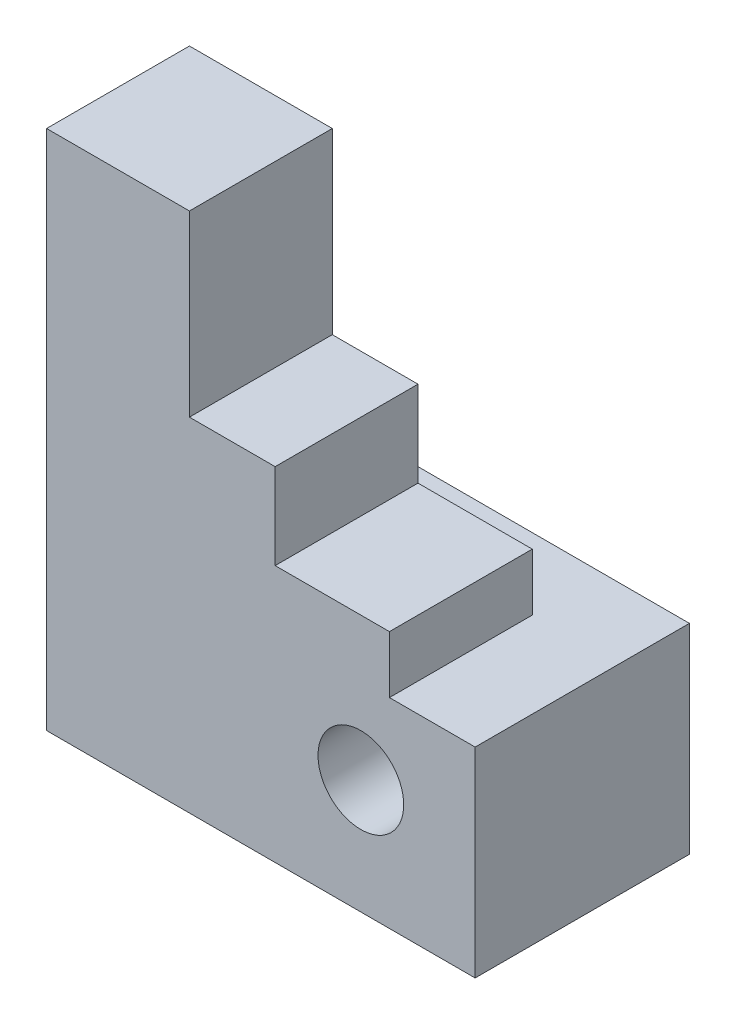
ISO-10303-21;
HEADER;
FILE_DESCRIPTION(('STEP AP214'),'2;1');
FILE_NAME('part.step','',(''),(''),'','','');
FILE_SCHEMA(('AUTOMOTIVE_DESIGN { 1 0 10303 214 1 1 1 1 }'));
ENDSEC;
DATA;
#1=APPLICATION_CONTEXT('core data for automotive mechanical design processes');
#2=APPLICATION_PROTOCOL_DEFINITION('international standard','automotive_design',2000,#1);
#3=PRODUCT_CONTEXT('',#1,'mechanical');
#4=PRODUCT('Part','Part','',(#3));
#5=PRODUCT_RELATED_PRODUCT_CATEGORY('part','',(#4));
#6=PRODUCT_DEFINITION_FORMATION('','',#4);
#7=PRODUCT_DEFINITION_CONTEXT('part definition',#1,'design');
#8=PRODUCT_DEFINITION('design','',#6,#7);
#9=PRODUCT_DEFINITION_SHAPE('','',#8);
#10=(LENGTH_UNIT() NAMED_UNIT(*) SI_UNIT(.MILLI.,.METRE.));
#11=(NAMED_UNIT(*) PLANE_ANGLE_UNIT() SI_UNIT($,.RADIAN.));
#12=(NAMED_UNIT(*) SI_UNIT($,.STERADIAN.) SOLID_ANGLE_UNIT());
#13=UNCERTAINTY_MEASURE_WITH_UNIT(LENGTH_MEASURE(1.E-05),#10,'distance_accuracy_value','');
#14=(GEOMETRIC_REPRESENTATION_CONTEXT(3) GLOBAL_UNCERTAINTY_ASSIGNED_CONTEXT((#13)) GLOBAL_UNIT_ASSIGNED_CONTEXT((#10,
#11,#12)) REPRESENTATION_CONTEXT('',''));
#15=CARTESIAN_POINT('',(0.,0.,0.));
#16=DIRECTION('',(0.,0.,1.));
#17=DIRECTION('',(1.,0.,0.));
#18=AXIS2_PLACEMENT_3D('',#15,#16,#17);
#19=CARTESIAN_POINT('',(0.,28.,0.));
#20=DIRECTION('',(0.,-1.,0.));
#21=DIRECTION('',(0.,0.,-1.));
#22=AXIS2_PLACEMENT_3D('',#19,#20,#21);
#23=PLANE('',#22);
#24=DIRECTION('',(-1.,0.,0.));
#25=VECTOR('',#24,1.);
#26=CARTESIAN_POINT('',(48.,28.,-20.));
#27=LINE('',#26,#25);
#28=CARTESIAN_POINT('',(48.,28.,-20.));
#29=VERTEX_POINT('',#28);
#30=CARTESIAN_POINT('',(0.,28.,-20.));
#31=VERTEX_POINT('',#30);
#32=EDGE_CURVE('E146',#29,#31,#27,.T.);
#33=ORIENTED_EDGE('',*,*,#32,.F.);
#34=DIRECTION('',(0.,0.,1.));
#35=VECTOR('',#34,1.);
#36=CARTESIAN_POINT('',(48.,28.,-20.));
#37=LINE('',#36,#35);
#38=CARTESIAN_POINT('',(48.,28.,0.));
#39=VERTEX_POINT('',#38);
#40=EDGE_CURVE('E206',#29,#39,#37,.T.);
#41=ORIENTED_EDGE('',*,*,#40,.T.);
#42=DIRECTION('',(1.,0.,0.));
#43=VECTOR('',#42,1.);
#44=CARTESIAN_POINT('',(60.,28.,0.));
#45=LINE('',#44,#43);
#46=CARTESIAN_POINT('',(60.,28.,0.));
#47=VERTEX_POINT('',#46);
#48=EDGE_CURVE('E86',#39,#47,#45,.T.);
#49=ORIENTED_EDGE('',*,*,#48,.T.);
#50=DIRECTION('',(0.,0.,-1.));
#51=VECTOR('',#50,1.);
#52=CARTESIAN_POINT('',(60.,28.,-30.));
#53=LINE('',#52,#51);
#54=CARTESIAN_POINT('',(60.,28.,-30.));
#55=VERTEX_POINT('',#54);
#56=EDGE_CURVE('E163',#47,#55,#53,.T.);
#57=ORIENTED_EDGE('',*,*,#56,.T.);
#58=DIRECTION('',(-1.,0.,0.));
#59=VECTOR('',#58,1.);
#60=CARTESIAN_POINT('',(0.,28.,-30.));
#61=LINE('',#60,#59);
#62=CARTESIAN_POINT('',(0.,28.,-30.));
#63=VERTEX_POINT('',#62);
#64=EDGE_CURVE('E64',#55,#63,#61,.T.);
#65=ORIENTED_EDGE('',*,*,#64,.T.);
#66=DIRECTION('',(0.,0.,1.));
#67=VECTOR('',#66,1.);
#68=CARTESIAN_POINT('',(0.,28.,0.));
#69=LINE('',#68,#67);
#70=EDGE_CURVE('E170',#63,#31,#69,.T.);
#71=ORIENTED_EDGE('',*,*,#70,.T.);
#72=EDGE_LOOP('',(#33,#41,#49,#57,#65,#71));
#73=FACE_BOUND('',#72,.T.);
#74=ADVANCED_FACE('F39',(#73),#23,.F.);
#75=CARTESIAN_POINT('',(60.,28.,0.));
#76=DIRECTION('',(0.,0.,-1.));
#77=DIRECTION('',(-1.,0.,0.));
#78=AXIS2_PLACEMENT_3D('',#75,#76,#77);
#79=PLANE('',#78);
#80=CARTESIAN_POINT('',(44.,16.,0.));
#81=DIRECTION('',(0.,0.,-1.));
#82=DIRECTION('',(-1.,0.,0.));
#83=AXIS2_PLACEMENT_3D('',#80,#81,#82);
#84=CIRCLE('',#83,6.);
#85=CARTESIAN_POINT('',(38.,16.,0.));
#86=VERTEX_POINT('',#85);
#87=EDGE_CURVE('E190',#86,#86,#84,.T.);
#88=ORIENTED_EDGE('',*,*,#87,.T.);
#89=EDGE_LOOP('',(#88));
#90=FACE_BOUND('',#89,.T.);
#91=DIRECTION('',(1.,0.,0.));
#92=VECTOR('',#91,1.);
#93=CARTESIAN_POINT('',(60.,0.,0.));
#94=LINE('',#93,#92);
#95=CARTESIAN_POINT('',(0.,0.,0.));
#96=VERTEX_POINT('',#95);
#97=CARTESIAN_POINT('',(60.,0.,0.));
#98=VERTEX_POINT('',#97);
#99=EDGE_CURVE('E152',#96,#98,#94,.T.);
#100=ORIENTED_EDGE('',*,*,#99,.T.);
#101=DIRECTION('',(0.,-1.,0.));
#102=VECTOR('',#101,1.);
#103=CARTESIAN_POINT('',(60.,28.,0.));
#104=LINE('',#103,#102);
#105=EDGE_CURVE('E11',#47,#98,#104,.T.);
#106=ORIENTED_EDGE('',*,*,#105,.F.);
#107=ORIENTED_EDGE('',*,*,#48,.F.);
#108=DIRECTION('',(0.,-1.,0.));
#109=VECTOR('',#108,1.);
#110=CARTESIAN_POINT('',(48.,36.,0.));
#111=LINE('',#110,#109);
#112=CARTESIAN_POINT('',(48.,36.,0.));
#113=VERTEX_POINT('',#112);
#114=EDGE_CURVE('E53',#113,#39,#111,.T.);
#115=ORIENTED_EDGE('',*,*,#114,.F.);
#116=DIRECTION('',(1.,0.,0.));
#117=VECTOR('',#116,1.);
#118=CARTESIAN_POINT('',(32.,36.,0.));
#119=LINE('',#118,#117);
#120=CARTESIAN_POINT('',(32.,36.,0.));
#121=VERTEX_POINT('',#120);
#122=EDGE_CURVE('E201',#121,#113,#119,.T.);
#123=ORIENTED_EDGE('',*,*,#122,.F.);
#124=DIRECTION('',(0.,-1.,0.));
#125=VECTOR('',#124,1.);
#126=CARTESIAN_POINT('',(32.,48.,0.));
#127=LINE('',#126,#125);
#128=CARTESIAN_POINT('',(32.,48.,0.));
#129=VERTEX_POINT('',#128);
#130=EDGE_CURVE('E203',#129,#121,#127,.T.);
#131=ORIENTED_EDGE('',*,*,#130,.F.);
#132=DIRECTION('',(1.,0.,0.));
#133=VECTOR('',#132,1.);
#134=CARTESIAN_POINT('',(20.,48.,0.));
#135=LINE('',#134,#133);
#136=CARTESIAN_POINT('',(20.,48.,0.));
#137=VERTEX_POINT('',#136);
#138=EDGE_CURVE('E194',#137,#129,#135,.T.);
#139=ORIENTED_EDGE('',*,*,#138,.F.);
#140=DIRECTION('',(0.,-1.,0.));
#141=VECTOR('',#140,1.);
#142=CARTESIAN_POINT('',(20.,73.,0.));
#143=LINE('',#142,#141);
#144=CARTESIAN_POINT('',(20.,73.,0.));
#145=VERTEX_POINT('',#144);
#146=EDGE_CURVE('E188',#145,#137,#143,.T.);
#147=ORIENTED_EDGE('',*,*,#146,.F.);
#148=DIRECTION('',(1.,0.,0.));
#149=VECTOR('',#148,1.);
#150=CARTESIAN_POINT('',(0.,73.,0.));
#151=LINE('',#150,#149);
#152=CARTESIAN_POINT('',(0.,73.,0.));
#153=VERTEX_POINT('',#152);
#154=EDGE_CURVE('E187',#153,#145,#151,.T.);
#155=ORIENTED_EDGE('',*,*,#154,.F.);
#156=DIRECTION('',(0.,-1.,0.));
#157=VECTOR('',#156,1.);
#158=CARTESIAN_POINT('',(0.,28.,0.));
#159=LINE('',#158,#157);
#160=EDGE_CURVE('E155',#153,#96,#159,.T.);
#161=ORIENTED_EDGE('',*,*,#160,.T.);
#162=EDGE_LOOP('',(#100,#106,#107,#115,#123,#131,#139,#147,#155,#161));
#163=FACE_BOUND('',#162,.T.);
#164=ADVANCED_FACE('F41',(#90,#163),#79,.F.);
#165=CARTESIAN_POINT('',(60.,28.,-30.));
#166=DIRECTION('',(-1.,0.,0.));
#167=DIRECTION('',(0.,0.,1.));
#168=AXIS2_PLACEMENT_3D('',#165,#166,#167);
#169=PLANE('',#168);
#170=DIRECTION('',(0.,0.,-1.));
#171=VECTOR('',#170,1.);
#172=CARTESIAN_POINT('',(60.,0.,-30.));
#173=LINE('',#172,#171);
#174=CARTESIAN_POINT('',(60.,0.,-30.));
#175=VERTEX_POINT('',#174);
#176=EDGE_CURVE('E160',#98,#175,#173,.T.);
#177=ORIENTED_EDGE('',*,*,#176,.T.);
#178=DIRECTION('',(0.,-1.,0.));
#179=VECTOR('',#178,1.);
#180=CARTESIAN_POINT('',(60.,28.,-30.));
#181=LINE('',#180,#179);
#182=EDGE_CURVE('E50',#55,#175,#181,.T.);
#183=ORIENTED_EDGE('',*,*,#182,.F.);
#184=ORIENTED_EDGE('',*,*,#56,.F.);
#185=ORIENTED_EDGE('',*,*,#105,.T.);
#186=EDGE_LOOP('',(#177,#183,#184,#185));
#187=FACE_BOUND('',#186,.T.);
#188=ADVANCED_FACE('F250',(#187),#169,.F.);
#189=CARTESIAN_POINT('',(0.,28.,-30.));
#190=DIRECTION('',(0.,0.,1.));
#191=DIRECTION('',(1.,0.,0.));
#192=AXIS2_PLACEMENT_3D('',#189,#190,#191);
#193=PLANE('',#192);
#194=CARTESIAN_POINT('',(44.,16.,-30.));
#195=DIRECTION('',(0.,0.,-1.));
#196=DIRECTION('',(-1.,0.,0.));
#197=AXIS2_PLACEMENT_3D('',#194,#195,#196);
#198=CIRCLE('',#197,6.);
#199=CARTESIAN_POINT('',(38.,16.,-30.));
#200=VERTEX_POINT('',#199);
#201=EDGE_CURVE('E191',#200,#200,#198,.T.);
#202=ORIENTED_EDGE('',*,*,#201,.F.);
#203=EDGE_LOOP('',(#202));
#204=FACE_BOUND('',#203,.T.);
#205=DIRECTION('',(-1.,0.,0.));
#206=VECTOR('',#205,1.);
#207=CARTESIAN_POINT('',(0.,0.,-30.));
#208=LINE('',#207,#206);
#209=CARTESIAN_POINT('',(0.,0.,-30.));
#210=VERTEX_POINT('',#209);
#211=EDGE_CURVE('E168',#175,#210,#208,.T.);
#212=ORIENTED_EDGE('',*,*,#211,.T.);
#213=DIRECTION('',(0.,-1.,0.));
#214=VECTOR('',#213,1.);
#215=CARTESIAN_POINT('',(0.,28.,-30.));
#216=LINE('',#215,#214);
#217=EDGE_CURVE('E173',#63,#210,#216,.T.);
#218=ORIENTED_EDGE('',*,*,#217,.F.);
#219=ORIENTED_EDGE('',*,*,#64,.F.);
#220=ORIENTED_EDGE('',*,*,#182,.T.);
#221=EDGE_LOOP('',(#212,#218,#219,#220));
#222=FACE_BOUND('',#221,.T.);
#223=ADVANCED_FACE('F180',(#204,#222),#193,.F.);
#224=CARTESIAN_POINT('',(0.,28.,0.));
#225=DIRECTION('',(1.,0.,0.));
#226=DIRECTION('',(0.,0.,-1.));
#227=AXIS2_PLACEMENT_3D('',#224,#225,#226);
#228=PLANE('',#227);
#229=DIRECTION('',(0.,0.,1.));
#230=VECTOR('',#229,1.);
#231=CARTESIAN_POINT('',(0.,0.,0.));
#232=LINE('',#231,#230);
#233=EDGE_CURVE('E85',#210,#96,#232,.T.);
#234=ORIENTED_EDGE('',*,*,#233,.T.);
#235=ORIENTED_EDGE('',*,*,#160,.F.);
#236=DIRECTION('',(0.,0.,1.));
#237=VECTOR('',#236,1.);
#238=CARTESIAN_POINT('',(0.,73.,-20.));
#239=LINE('',#238,#237);
#240=CARTESIAN_POINT('',(0.,73.,-20.));
#241=VERTEX_POINT('',#240);
#242=EDGE_CURVE('E139',#241,#153,#239,.T.);
#243=ORIENTED_EDGE('',*,*,#242,.F.);
#244=DIRECTION('',(0.,1.,0.));
#245=VECTOR('',#244,1.);
#246=CARTESIAN_POINT('',(0.,28.,-20.));
#247=LINE('',#246,#245);
#248=EDGE_CURVE('E141',#31,#241,#247,.T.);
#249=ORIENTED_EDGE('',*,*,#248,.F.);
#250=ORIENTED_EDGE('',*,*,#70,.F.);
#251=ORIENTED_EDGE('',*,*,#217,.T.);
#252=EDGE_LOOP('',(#234,#235,#243,#249,#250,#251));
#253=FACE_BOUND('',#252,.T.);
#254=ADVANCED_FACE('F151',(#253),#228,.F.);
#255=CARTESIAN_POINT('',(0.,0.,0.));
#256=DIRECTION('',(0.,-1.,0.));
#257=DIRECTION('',(0.,0.,-1.));
#258=AXIS2_PLACEMENT_3D('',#255,#256,#257);
#259=PLANE('',#258);
#260=ORIENTED_EDGE('',*,*,#99,.F.);
#261=ORIENTED_EDGE('',*,*,#233,.F.);
#262=ORIENTED_EDGE('',*,*,#211,.F.);
#263=ORIENTED_EDGE('',*,*,#176,.F.);
#264=EDGE_LOOP('',(#260,#261,#262,#263));
#265=FACE_BOUND('',#264,.T.);
#266=ADVANCED_FACE('F181',(#265),#259,.T.);
#267=CARTESIAN_POINT('',(0.,73.,-20.));
#268=DIRECTION('',(0.,-1.,0.));
#269=DIRECTION('',(0.,0.,-1.));
#270=AXIS2_PLACEMENT_3D('',#267,#268,#269);
#271=PLANE('',#270);
#272=ORIENTED_EDGE('',*,*,#154,.T.);
#273=DIRECTION('',(0.,0.,1.));
#274=VECTOR('',#273,1.);
#275=CARTESIAN_POINT('',(20.,73.,-20.));
#276=LINE('',#275,#274);
#277=CARTESIAN_POINT('',(20.,73.,-20.));
#278=VERTEX_POINT('',#277);
#279=EDGE_CURVE('E140',#278,#145,#276,.T.);
#280=ORIENTED_EDGE('',*,*,#279,.F.);
#281=DIRECTION('',(1.,0.,0.));
#282=VECTOR('',#281,1.);
#283=CARTESIAN_POINT('',(0.,73.,-20.));
#284=LINE('',#283,#282);
#285=EDGE_CURVE('E134',#241,#278,#284,.T.);
#286=ORIENTED_EDGE('',*,*,#285,.F.);
#287=ORIENTED_EDGE('',*,*,#242,.T.);
#288=EDGE_LOOP('',(#272,#280,#286,#287));
#289=FACE_BOUND('',#288,.T.);
#290=ADVANCED_FACE('F135',(#289),#271,.F.);
#291=CARTESIAN_POINT('',(20.,73.,-20.));
#292=DIRECTION('',(-1.,0.,0.));
#293=DIRECTION('',(0.,0.,1.));
#294=AXIS2_PLACEMENT_3D('',#291,#292,#293);
#295=PLANE('',#294);
#296=ORIENTED_EDGE('',*,*,#146,.T.);
#297=DIRECTION('',(0.,0.,1.));
#298=VECTOR('',#297,1.);
#299=CARTESIAN_POINT('',(20.,48.,-20.));
#300=LINE('',#299,#298);
#301=CARTESIAN_POINT('',(20.,48.,-20.));
#302=VERTEX_POINT('',#301);
#303=EDGE_CURVE('E157',#302,#137,#300,.T.);
#304=ORIENTED_EDGE('',*,*,#303,.F.);
#305=DIRECTION('',(0.,-1.,0.));
#306=VECTOR('',#305,1.);
#307=CARTESIAN_POINT('',(20.,73.,-20.));
#308=LINE('',#307,#306);
#309=EDGE_CURVE('E142',#278,#302,#308,.T.);
#310=ORIENTED_EDGE('',*,*,#309,.F.);
#311=ORIENTED_EDGE('',*,*,#279,.T.);
#312=EDGE_LOOP('',(#296,#304,#310,#311));
#313=FACE_BOUND('',#312,.T.);
#314=ADVANCED_FACE('F269',(#313),#295,.F.);
#315=CARTESIAN_POINT('',(20.,48.,-20.));
#316=DIRECTION('',(0.,-1.,0.));
#317=DIRECTION('',(0.,0.,-1.));
#318=AXIS2_PLACEMENT_3D('',#315,#316,#317);
#319=PLANE('',#318);
#320=ORIENTED_EDGE('',*,*,#138,.T.);
#321=DIRECTION('',(0.,0.,1.));
#322=VECTOR('',#321,1.);
#323=CARTESIAN_POINT('',(32.,48.,-20.));
#324=LINE('',#323,#322);
#325=CARTESIAN_POINT('',(32.,48.,-20.));
#326=VERTEX_POINT('',#325);
#327=EDGE_CURVE('E213',#326,#129,#324,.T.);
#328=ORIENTED_EDGE('',*,*,#327,.F.);
#329=DIRECTION('',(1.,0.,0.));
#330=VECTOR('',#329,1.);
#331=CARTESIAN_POINT('',(20.,48.,-20.));
#332=LINE('',#331,#330);
#333=EDGE_CURVE('E222',#302,#326,#332,.T.);
#334=ORIENTED_EDGE('',*,*,#333,.F.);
#335=ORIENTED_EDGE('',*,*,#303,.T.);
#336=EDGE_LOOP('',(#320,#328,#334,#335));
#337=FACE_BOUND('',#336,.T.);
#338=ADVANCED_FACE('F218',(#337),#319,.F.);
#339=CARTESIAN_POINT('',(32.,48.,-20.));
#340=DIRECTION('',(-1.,0.,0.));
#341=DIRECTION('',(0.,0.,1.));
#342=AXIS2_PLACEMENT_3D('',#339,#340,#341);
#343=PLANE('',#342);
#344=ORIENTED_EDGE('',*,*,#130,.T.);
#345=DIRECTION('',(0.,0.,1.));
#346=VECTOR('',#345,1.);
#347=CARTESIAN_POINT('',(32.,36.,-20.));
#348=LINE('',#347,#346);
#349=CARTESIAN_POINT('',(32.,36.,-20.));
#350=VERTEX_POINT('',#349);
#351=EDGE_CURVE('E209',#350,#121,#348,.T.);
#352=ORIENTED_EDGE('',*,*,#351,.F.);
#353=DIRECTION('',(0.,-1.,0.));
#354=VECTOR('',#353,1.);
#355=CARTESIAN_POINT('',(32.,48.,-20.));
#356=LINE('',#355,#354);
#357=EDGE_CURVE('E237',#326,#350,#356,.T.);
#358=ORIENTED_EDGE('',*,*,#357,.F.);
#359=ORIENTED_EDGE('',*,*,#327,.T.);
#360=EDGE_LOOP('',(#344,#352,#358,#359));
#361=FACE_BOUND('',#360,.T.);
#362=ADVANCED_FACE('F227',(#361),#343,.F.);
#363=CARTESIAN_POINT('',(32.,36.,-20.));
#364=DIRECTION('',(0.,-1.,0.));
#365=DIRECTION('',(0.,0.,-1.));
#366=AXIS2_PLACEMENT_3D('',#363,#364,#365);
#367=PLANE('',#366);
#368=ORIENTED_EDGE('',*,*,#122,.T.);
#369=DIRECTION('',(0.,0.,1.));
#370=VECTOR('',#369,1.);
#371=CARTESIAN_POINT('',(48.,36.,-20.));
#372=LINE('',#371,#370);
#373=CARTESIAN_POINT('',(48.,36.,-20.));
#374=VERTEX_POINT('',#373);
#375=EDGE_CURVE('E208',#374,#113,#372,.T.);
#376=ORIENTED_EDGE('',*,*,#375,.F.);
#377=DIRECTION('',(1.,0.,0.));
#378=VECTOR('',#377,1.);
#379=CARTESIAN_POINT('',(32.,36.,-20.));
#380=LINE('',#379,#378);
#381=EDGE_CURVE('E232',#350,#374,#380,.T.);
#382=ORIENTED_EDGE('',*,*,#381,.F.);
#383=ORIENTED_EDGE('',*,*,#351,.T.);
#384=EDGE_LOOP('',(#368,#376,#382,#383));
#385=FACE_BOUND('',#384,.T.);
#386=ADVANCED_FACE('F233',(#385),#367,.F.);
#387=CARTESIAN_POINT('',(48.,36.,-20.));
#388=DIRECTION('',(-1.,0.,0.));
#389=DIRECTION('',(0.,0.,1.));
#390=AXIS2_PLACEMENT_3D('',#387,#388,#389);
#391=PLANE('',#390);
#392=ORIENTED_EDGE('',*,*,#114,.T.);
#393=ORIENTED_EDGE('',*,*,#40,.F.);
#394=DIRECTION('',(0.,-1.,0.));
#395=VECTOR('',#394,1.);
#396=CARTESIAN_POINT('',(48.,36.,-20.));
#397=LINE('',#396,#395);
#398=EDGE_CURVE('E231',#374,#29,#397,.T.);
#399=ORIENTED_EDGE('',*,*,#398,.F.);
#400=ORIENTED_EDGE('',*,*,#375,.T.);
#401=EDGE_LOOP('',(#392,#393,#399,#400));
#402=FACE_BOUND('',#401,.T.);
#403=ADVANCED_FACE('F284',(#402),#391,.F.);
#404=CARTESIAN_POINT('',(0.,0.,-20.));
#405=DIRECTION('',(0.,0.,-1.));
#406=DIRECTION('',(-1.,0.,0.));
#407=AXIS2_PLACEMENT_3D('',#404,#405,#406);
#408=PLANE('',#407);
#409=ORIENTED_EDGE('',*,*,#248,.T.);
#410=ORIENTED_EDGE('',*,*,#285,.T.);
#411=ORIENTED_EDGE('',*,*,#309,.T.);
#412=ORIENTED_EDGE('',*,*,#333,.T.);
#413=ORIENTED_EDGE('',*,*,#357,.T.);
#414=ORIENTED_EDGE('',*,*,#381,.T.);
#415=ORIENTED_EDGE('',*,*,#398,.T.);
#416=ORIENTED_EDGE('',*,*,#32,.T.);
#417=EDGE_LOOP('',(#409,#410,#411,#412,#413,#414,#415,#416));
#418=FACE_BOUND('',#417,.T.);
#419=ADVANCED_FACE('F148',(#418),#408,.T.);
#420=CARTESIAN_POINT('',(44.,16.,30.));
#421=DIRECTION('',(0.,0.,-1.));
#422=DIRECTION('',(-1.,0.,0.));
#423=AXIS2_PLACEMENT_3D('',#420,#421,#422);
#424=CYLINDRICAL_SURFACE('',#423,6.);
#425=ORIENTED_EDGE('',*,*,#201,.T.);
#426=EDGE_LOOP('',(#425));
#427=FACE_BOUND('',#426,.T.);
#428=ORIENTED_EDGE('',*,*,#87,.F.);
#429=EDGE_LOOP('',(#428));
#430=FACE_BOUND('',#429,.T.);
#431=ADVANCED_FACE('F245',(#427,#430),#424,.F.);
#432=CLOSED_SHELL('',(#74,#164,#188,#223,#254,#266,#290,#314,#338,#362,#386,#403,#419,#431));
#433=MANIFOLD_SOLID_BREP('B2',#432);
#434=ADVANCED_BREP_SHAPE_REPRESENTATION('',(#18,#433),#14);
#435=SHAPE_DEFINITION_REPRESENTATION(#9,#434);
ENDSEC;
END-ISO-10303-21;
